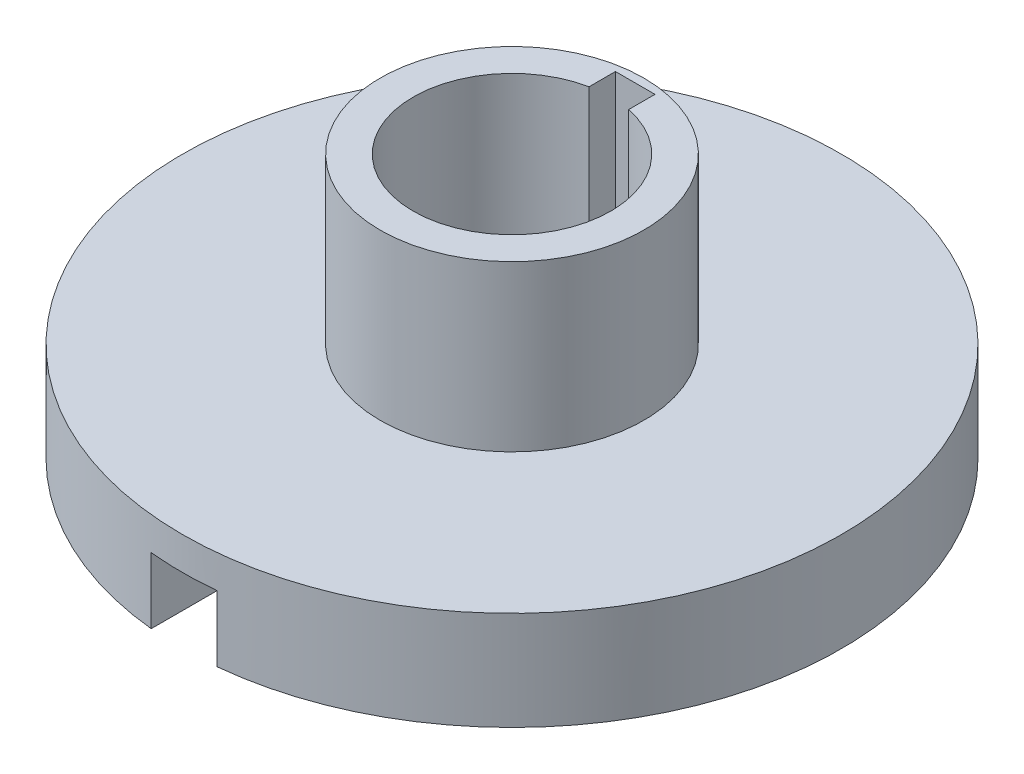
ISO-10303-21;
HEADER;
FILE_DESCRIPTION(('STEP AP214'),'2;1');
FILE_NAME('part.step','',(''),(''),'','','');
FILE_SCHEMA(('AUTOMOTIVE_DESIGN { 1 0 10303 214 1 1 1 1 }'));
ENDSEC;
DATA;
#1=APPLICATION_CONTEXT('core data for automotive mechanical design processes');
#2=APPLICATION_PROTOCOL_DEFINITION('international standard','automotive_design',2000,#1);
#3=PRODUCT_CONTEXT('',#1,'mechanical');
#4=PRODUCT('Part','Part','',(#3));
#5=PRODUCT_RELATED_PRODUCT_CATEGORY('part','',(#4));
#6=PRODUCT_DEFINITION_FORMATION('','',#4);
#7=PRODUCT_DEFINITION_CONTEXT('part definition',#1,'design');
#8=PRODUCT_DEFINITION('design','',#6,#7);
#9=PRODUCT_DEFINITION_SHAPE('','',#8);
#10=(LENGTH_UNIT() NAMED_UNIT(*) SI_UNIT(.MILLI.,.METRE.));
#11=(NAMED_UNIT(*) PLANE_ANGLE_UNIT() SI_UNIT($,.RADIAN.));
#12=(NAMED_UNIT(*) SI_UNIT($,.STERADIAN.) SOLID_ANGLE_UNIT());
#13=UNCERTAINTY_MEASURE_WITH_UNIT(LENGTH_MEASURE(1.E-05),#10,'distance_accuracy_value','');
#14=(GEOMETRIC_REPRESENTATION_CONTEXT(3) GLOBAL_UNCERTAINTY_ASSIGNED_CONTEXT((#13)) GLOBAL_UNIT_ASSIGNED_CONTEXT((#10,
#11,#12)) REPRESENTATION_CONTEXT('',''));
#15=CARTESIAN_POINT('',(0.,0.,0.));
#16=DIRECTION('',(0.,0.,1.));
#17=DIRECTION('',(1.,0.,0.));
#18=AXIS2_PLACEMENT_3D('',#15,#16,#17);
#19=CARTESIAN_POINT('',(0.,0.,0.));
#20=DIRECTION('',(0.,1.,0.));
#21=DIRECTION('',(0.,0.,1.));
#22=AXIS2_PLACEMENT_3D('',#19,#20,#21);
#23=PLANE('',#22);
#24=CARTESIAN_POINT('',(0.,0.,0.));
#25=DIRECTION('',(0.,1.,0.));
#26=DIRECTION('',(0.,0.,1.));
#27=AXIS2_PLACEMENT_3D('',#24,#25,#26);
#28=CIRCLE('',#27,50.);
#29=CARTESIAN_POINT('',(5.00000000000001,0.,49.749371855331));
#30=VERTEX_POINT('',#29);
#31=CARTESIAN_POINT('',(5.,0.,-49.749371855331));
#32=VERTEX_POINT('',#31);
#33=EDGE_CURVE('E220',#30,#32,#28,.T.);
#34=ORIENTED_EDGE('',*,*,#33,.F.);
#35=DIRECTION('',(0.,0.,1.));
#36=VECTOR('',#35,1.);
#37=CARTESIAN_POINT('',(5.00000000000001,0.,49.749371855331));
#38=LINE('',#37,#36);
#39=CARTESIAN_POINT('',(5.00000000000001,0.,14.1421356237309));
#40=VERTEX_POINT('',#39);
#41=EDGE_CURVE('E252',#40,#30,#38,.T.);
#42=ORIENTED_EDGE('',*,*,#41,.F.);
#43=CARTESIAN_POINT('',(0.,0.,0.));
#44=DIRECTION('',(0.,1.,0.));
#45=DIRECTION('',(0.,0.,1.));
#46=AXIS2_PLACEMENT_3D('',#43,#44,#45);
#47=CIRCLE('',#46,15.);
#48=CARTESIAN_POINT('',(5.00000000000001,0.,-14.1421356237309));
#49=VERTEX_POINT('',#48);
#50=EDGE_CURVE('E196',#40,#49,#47,.T.);
#51=ORIENTED_EDGE('',*,*,#50,.T.);
#52=EDGE_CURVE('E148',#32,#49,#38,.T.);
#53=ORIENTED_EDGE('',*,*,#52,.F.);
#54=EDGE_LOOP('',(#34,#42,#51,#53));
#55=FACE_BOUND('',#54,.T.);
#56=ADVANCED_FACE('F41',(#55),#23,.F.);
#57=CARTESIAN_POINT('',(-3.,40.,0.));
#58=DIRECTION('',(-1.,0.,0.));
#59=DIRECTION('',(0.,0.,1.));
#60=AXIS2_PLACEMENT_3D('',#57,#58,#59);
#61=PLANE('',#60);
#62=DIRECTION('',(0.,0.,1.));
#63=VECTOR('',#62,1.);
#64=CARTESIAN_POINT('',(-3.,10.,0.));
#65=LINE('',#64,#63);
#66=CARTESIAN_POINT('',(-3.,10.,-18.6969384566991));
#67=VERTEX_POINT('',#66);
#68=CARTESIAN_POINT('',(-3.,10.,-14.6969384566991));
#69=VERTEX_POINT('',#68);
#70=EDGE_CURVE('E169',#67,#69,#65,.T.);
#71=ORIENTED_EDGE('',*,*,#70,.F.);
#72=DIRECTION('',(0.,-1.,0.));
#73=VECTOR('',#72,1.);
#74=CARTESIAN_POINT('',(-3.,40.,-18.6969384566991));
#75=LINE('',#74,#73);
#76=CARTESIAN_POINT('',(-3.,40.,-18.6969384566991));
#77=VERTEX_POINT('',#76);
#78=EDGE_CURVE('E207',#77,#67,#75,.T.);
#79=ORIENTED_EDGE('',*,*,#78,.F.);
#80=DIRECTION('',(0.,0.,-1.));
#81=VECTOR('',#80,1.);
#82=CARTESIAN_POINT('',(-3.,40.,0.));
#83=LINE('',#82,#81);
#84=CARTESIAN_POINT('',(-3.,40.,-14.6969384566991));
#85=VERTEX_POINT('',#84);
#86=EDGE_CURVE('E181',#85,#77,#83,.T.);
#87=ORIENTED_EDGE('',*,*,#86,.F.);
#88=DIRECTION('',(0.,-1.,0.));
#89=VECTOR('',#88,1.);
#90=CARTESIAN_POINT('',(-3.,40.,-14.6969384566991));
#91=LINE('',#90,#89);
#92=EDGE_CURVE('E211',#85,#69,#91,.T.);
#93=ORIENTED_EDGE('',*,*,#92,.T.);
#94=EDGE_LOOP('',(#71,#79,#87,#93));
#95=FACE_BOUND('',#94,.T.);
#96=ADVANCED_FACE('F286',(#95),#61,.F.);
#97=CARTESIAN_POINT('',(0.,40.,-18.6969384566991));
#98=DIRECTION('',(0.,0.,-1.));
#99=DIRECTION('',(-1.,0.,0.));
#100=AXIS2_PLACEMENT_3D('',#97,#98,#99);
#101=PLANE('',#100);
#102=DIRECTION('',(-1.,0.,0.));
#103=VECTOR('',#102,1.);
#104=CARTESIAN_POINT('',(0.,10.,-18.6969384566991));
#105=LINE('',#104,#103);
#106=CARTESIAN_POINT('',(3.,10.,-18.6969384566991));
#107=VERTEX_POINT('',#106);
#108=EDGE_CURVE('E166',#107,#67,#105,.T.);
#109=ORIENTED_EDGE('',*,*,#108,.F.);
#110=DIRECTION('',(0.,-1.,0.));
#111=VECTOR('',#110,1.);
#112=CARTESIAN_POINT('',(3.,40.,-18.6969384566991));
#113=LINE('',#112,#111);
#114=CARTESIAN_POINT('',(3.,40.,-18.6969384566991));
#115=VERTEX_POINT('',#114);
#116=EDGE_CURVE('E203',#115,#107,#113,.T.);
#117=ORIENTED_EDGE('',*,*,#116,.F.);
#118=DIRECTION('',(1.,0.,0.));
#119=VECTOR('',#118,1.);
#120=CARTESIAN_POINT('',(0.,40.,-18.6969384566991));
#121=LINE('',#120,#119);
#122=EDGE_CURVE('E185',#77,#115,#121,.T.);
#123=ORIENTED_EDGE('',*,*,#122,.F.);
#124=ORIENTED_EDGE('',*,*,#78,.T.);
#125=EDGE_LOOP('',(#109,#117,#123,#124));
#126=FACE_BOUND('',#125,.T.);
#127=ADVANCED_FACE('F281',(#126),#101,.F.);
#128=CARTESIAN_POINT('',(3.,40.,0.));
#129=DIRECTION('',(1.,0.,0.));
#130=DIRECTION('',(0.,0.,-1.));
#131=AXIS2_PLACEMENT_3D('',#128,#129,#130);
#132=PLANE('',#131);
#133=DIRECTION('',(0.,0.,-1.));
#134=VECTOR('',#133,1.);
#135=CARTESIAN_POINT('',(3.,10.,0.));
#136=LINE('',#135,#134);
#137=CARTESIAN_POINT('',(3.,10.,-14.6969384566991));
#138=VERTEX_POINT('',#137);
#139=EDGE_CURVE('E224',#138,#107,#136,.T.);
#140=ORIENTED_EDGE('',*,*,#139,.F.);
#141=DIRECTION('',(0.,-1.,0.));
#142=VECTOR('',#141,1.);
#143=CARTESIAN_POINT('',(3.,40.,-14.6969384566991));
#144=LINE('',#143,#142);
#145=CARTESIAN_POINT('',(3.,40.,-14.6969384566991));
#146=VERTEX_POINT('',#145);
#147=EDGE_CURVE('E195',#146,#138,#144,.T.);
#148=ORIENTED_EDGE('',*,*,#147,.F.);
#149=DIRECTION('',(0.,0.,1.));
#150=VECTOR('',#149,1.);
#151=CARTESIAN_POINT('',(3.,40.,0.));
#152=LINE('',#151,#150);
#153=EDGE_CURVE('E188',#115,#146,#152,.T.);
#154=ORIENTED_EDGE('',*,*,#153,.F.);
#155=ORIENTED_EDGE('',*,*,#116,.T.);
#156=EDGE_LOOP('',(#140,#148,#154,#155));
#157=FACE_BOUND('',#156,.T.);
#158=ADVANCED_FACE('F276',(#157),#132,.F.);
#159=CARTESIAN_POINT('',(0.,15.,0.));
#160=DIRECTION('',(0.,-1.,0.));
#161=DIRECTION('',(0.,0.,-1.));
#162=AXIS2_PLACEMENT_3D('',#159,#160,#161);
#163=CYLINDRICAL_SURFACE('',#162,50.);
#164=CARTESIAN_POINT('',(0.,10.,0.));
#165=DIRECTION('',(0.,-1.,0.));
#166=DIRECTION('',(0.,0.,-1.));
#167=AXIS2_PLACEMENT_3D('',#164,#165,#166);
#168=CIRCLE('',#167,50.);
#169=CARTESIAN_POINT('',(5.00000000000001,10.,49.749371855331));
#170=VERTEX_POINT('',#169);
#171=CARTESIAN_POINT('',(-4.99999999999999,10.,49.749371855331));
#172=VERTEX_POINT('',#171);
#173=EDGE_CURVE('E140',#170,#172,#168,.T.);
#174=ORIENTED_EDGE('',*,*,#173,.F.);
#175=DIRECTION('',(0.,-1.,0.));
#176=VECTOR('',#175,1.);
#177=CARTESIAN_POINT('',(5.00000000000001,10.,49.749371855331));
#178=LINE('',#177,#176);
#179=EDGE_CURVE('E170',#170,#30,#178,.T.);
#180=ORIENTED_EDGE('',*,*,#179,.T.);
#181=ORIENTED_EDGE('',*,*,#33,.T.);
#182=DIRECTION('',(0.,-1.,0.));
#183=VECTOR('',#182,1.);
#184=CARTESIAN_POINT('',(5.,10.,-49.749371855331));
#185=LINE('',#184,#183);
#186=CARTESIAN_POINT('',(5.,10.,-49.749371855331));
#187=VERTEX_POINT('',#186);
#188=EDGE_CURVE('E161',#187,#32,#185,.T.);
#189=ORIENTED_EDGE('',*,*,#188,.F.);
#190=CARTESIAN_POINT('',(0.,10.,0.));
#191=DIRECTION('',(0.,-1.,0.));
#192=DIRECTION('',(0.,0.,-1.));
#193=AXIS2_PLACEMENT_3D('',#190,#191,#192);
#194=CIRCLE('',#193,50.);
#195=CARTESIAN_POINT('',(-4.99999999999999,10.,-49.749371855331));
#196=VERTEX_POINT('',#195);
#197=EDGE_CURVE('E136',#196,#187,#194,.T.);
#198=ORIENTED_EDGE('',*,*,#197,.F.);
#199=DIRECTION('',(0.,-1.,0.));
#200=VECTOR('',#199,1.);
#201=CARTESIAN_POINT('',(-4.99999999999999,10.,-49.749371855331));
#202=LINE('',#201,#200);
#203=CARTESIAN_POINT('',(-4.99999999999999,0.,-49.749371855331));
#204=VERTEX_POINT('',#203);
#205=EDGE_CURVE('E156',#196,#204,#202,.T.);
#206=ORIENTED_EDGE('',*,*,#205,.T.);
#207=CARTESIAN_POINT('',(-4.99999999999999,0.,49.749371855331));
#208=VERTEX_POINT('',#207);
#209=EDGE_CURVE('E154',#204,#208,#28,.T.);
#210=ORIENTED_EDGE('',*,*,#209,.T.);
#211=DIRECTION('',(0.,-1.,0.));
#212=VECTOR('',#211,1.);
#213=CARTESIAN_POINT('',(-4.99999999999999,10.,49.749371855331));
#214=LINE('',#213,#212);
#215=EDGE_CURVE('E131',#172,#208,#214,.T.);
#216=ORIENTED_EDGE('',*,*,#215,.F.);
#217=EDGE_LOOP('',(#174,#180,#181,#189,#198,#206,#210,#216));
#218=FACE_BOUND('',#217,.T.);
#219=CARTESIAN_POINT('',(0.,15.,0.));
#220=DIRECTION('',(0.,1.,0.));
#221=DIRECTION('',(0.,0.,1.));
#222=AXIS2_PLACEMENT_3D('',#219,#220,#221);
#223=CIRCLE('',#222,50.);
#224=CARTESIAN_POINT('',(0.,15.,50.));
#225=VERTEX_POINT('',#224);
#226=EDGE_CURVE('E219',#225,#225,#223,.T.);
#227=ORIENTED_EDGE('',*,*,#226,.F.);
#228=EDGE_LOOP('',(#227));
#229=FACE_BOUND('',#228,.T.);
#230=ADVANCED_FACE('F43',(#218,#229),#163,.T.);
#231=CARTESIAN_POINT('',(0.,15.,0.));
#232=DIRECTION('',(0.,1.,0.));
#233=DIRECTION('',(0.,0.,1.));
#234=AXIS2_PLACEMENT_3D('',#231,#232,#233);
#235=PLANE('',#234);
#236=CARTESIAN_POINT('',(0.,15.,0.));
#237=DIRECTION('',(0.,1.,0.));
#238=DIRECTION('',(0.,0.,1.));
#239=AXIS2_PLACEMENT_3D('',#236,#237,#238);
#240=CIRCLE('',#239,20.);
#241=CARTESIAN_POINT('',(0.,15.,20.));
#242=VERTEX_POINT('',#241);
#243=EDGE_CURVE('E215',#242,#242,#240,.T.);
#244=ORIENTED_EDGE('',*,*,#243,.F.);
#245=EDGE_LOOP('',(#244));
#246=FACE_BOUND('',#245,.T.);
#247=ORIENTED_EDGE('',*,*,#226,.T.);
#248=EDGE_LOOP('',(#247));
#249=FACE_BOUND('',#248,.T.);
#250=ADVANCED_FACE('F314',(#246,#249),#235,.T.);
#251=ORIENTED_EDGE('',*,*,#209,.F.);
#252=DIRECTION('',(0.,0.,-1.));
#253=VECTOR('',#252,1.);
#254=CARTESIAN_POINT('',(-4.99999999999999,0.,49.749371855331));
#255=LINE('',#254,#253);
#256=CARTESIAN_POINT('',(-4.99999999999999,0.,-14.142135623731));
#257=VERTEX_POINT('',#256);
#258=EDGE_CURVE('E255',#257,#204,#255,.T.);
#259=ORIENTED_EDGE('',*,*,#258,.F.);
#260=CARTESIAN_POINT('',(-4.99999999999999,0.,14.142135623731));
#261=VERTEX_POINT('',#260);
#262=EDGE_CURVE('E182',#257,#261,#47,.T.);
#263=ORIENTED_EDGE('',*,*,#262,.T.);
#264=EDGE_CURVE('E253',#208,#261,#255,.T.);
#265=ORIENTED_EDGE('',*,*,#264,.F.);
#266=EDGE_LOOP('',(#251,#259,#263,#265));
#267=FACE_BOUND('',#266,.T.);
#268=ADVANCED_FACE('F293',(#267),#23,.F.);
#269=CARTESIAN_POINT('',(0.,40.,0.));
#270=DIRECTION('',(0.,-1.,0.));
#271=DIRECTION('',(0.,0.,-1.));
#272=AXIS2_PLACEMENT_3D('',#269,#270,#271);
#273=CYLINDRICAL_SURFACE('',#272,15.);
#274=DIRECTION('',(0.,-1.,0.));
#275=VECTOR('',#274,1.);
#276=CARTESIAN_POINT('',(5.00000000000001,40.,14.1421356237309));
#277=LINE('',#276,#275);
#278=CARTESIAN_POINT('',(5.00000000000001,10.,14.1421356237309));
#279=VERTEX_POINT('',#278);
#280=EDGE_CURVE('E11',#279,#40,#277,.T.);
#281=ORIENTED_EDGE('',*,*,#280,.F.);
#282=CARTESIAN_POINT('',(0.,10.,0.));
#283=DIRECTION('',(0.,-1.,0.));
#284=DIRECTION('',(0.,0.,-1.));
#285=AXIS2_PLACEMENT_3D('',#282,#283,#284);
#286=CIRCLE('',#285,15.);
#287=CARTESIAN_POINT('',(-4.99999999999999,10.,14.142135623731));
#288=VERTEX_POINT('',#287);
#289=EDGE_CURVE('E176',#279,#288,#286,.T.);
#290=ORIENTED_EDGE('',*,*,#289,.T.);
#291=DIRECTION('',(0.,-1.,0.));
#292=VECTOR('',#291,1.);
#293=CARTESIAN_POINT('',(-4.99999999999999,40.,14.142135623731));
#294=LINE('',#293,#292);
#295=EDGE_CURVE('E50',#261,#288,#294,.F.);
#296=ORIENTED_EDGE('',*,*,#295,.F.);
#297=ORIENTED_EDGE('',*,*,#262,.F.);
#298=DIRECTION('',(0.,-1.,0.));
#299=VECTOR('',#298,1.);
#300=CARTESIAN_POINT('',(-4.99999999999999,40.,-14.142135623731));
#301=LINE('',#300,#299);
#302=CARTESIAN_POINT('',(-4.99999999999999,10.,-14.142135623731));
#303=VERTEX_POINT('',#302);
#304=EDGE_CURVE('E233',#303,#257,#301,.T.);
#305=ORIENTED_EDGE('',*,*,#304,.F.);
#306=EDGE_CURVE('E175',#303,#69,#286,.T.);
#307=ORIENTED_EDGE('',*,*,#306,.T.);
#308=ORIENTED_EDGE('',*,*,#92,.F.);
#309=CARTESIAN_POINT('',(0.,40.,0.));
#310=DIRECTION('',(0.,1.,0.));
#311=DIRECTION('',(0.,0.,1.));
#312=AXIS2_PLACEMENT_3D('',#309,#310,#311);
#313=CIRCLE('',#312,15.);
#314=EDGE_CURVE('E177',#85,#146,#313,.T.);
#315=ORIENTED_EDGE('',*,*,#314,.T.);
#316=ORIENTED_EDGE('',*,*,#147,.T.);
#317=CARTESIAN_POINT('',(5.00000000000001,10.,-14.1421356237309));
#318=VERTEX_POINT('',#317);
#319=EDGE_CURVE('E65',#138,#318,#286,.T.);
#320=ORIENTED_EDGE('',*,*,#319,.T.);
#321=DIRECTION('',(0.,-1.,0.));
#322=VECTOR('',#321,1.);
#323=CARTESIAN_POINT('',(5.00000000000001,40.,-14.1421356237309));
#324=LINE('',#323,#322);
#325=EDGE_CURVE('E230',#49,#318,#324,.F.);
#326=ORIENTED_EDGE('',*,*,#325,.F.);
#327=ORIENTED_EDGE('',*,*,#50,.F.);
#328=EDGE_LOOP('',(#281,#290,#296,#297,#305,#307,#308,#315,#316,#320,#326,#327));
#329=FACE_BOUND('',#328,.T.);
#330=ADVANCED_FACE('F271',(#329),#273,.F.);
#331=CARTESIAN_POINT('',(0.,40.,0.));
#332=DIRECTION('',(0.,-1.,0.));
#333=DIRECTION('',(0.,0.,-1.));
#334=AXIS2_PLACEMENT_3D('',#331,#332,#333);
#335=CYLINDRICAL_SURFACE('',#334,20.);
#336=ORIENTED_EDGE('',*,*,#243,.T.);
#337=EDGE_LOOP('',(#336));
#338=FACE_BOUND('',#337,.T.);
#339=CARTESIAN_POINT('',(0.,40.,0.));
#340=DIRECTION('',(0.,1.,0.));
#341=DIRECTION('',(0.,0.,1.));
#342=AXIS2_PLACEMENT_3D('',#339,#340,#341);
#343=CIRCLE('',#342,20.);
#344=CARTESIAN_POINT('',(0.,40.,20.));
#345=VERTEX_POINT('',#344);
#346=EDGE_CURVE('E191',#345,#345,#343,.T.);
#347=ORIENTED_EDGE('',*,*,#346,.F.);
#348=EDGE_LOOP('',(#347));
#349=FACE_BOUND('',#348,.T.);
#350=ADVANCED_FACE('F319',(#338,#349),#335,.T.);
#351=CARTESIAN_POINT('',(0.,40.,0.));
#352=DIRECTION('',(0.,1.,0.));
#353=DIRECTION('',(0.,0.,1.));
#354=AXIS2_PLACEMENT_3D('',#351,#352,#353);
#355=PLANE('',#354);
#356=ORIENTED_EDGE('',*,*,#314,.F.);
#357=ORIENTED_EDGE('',*,*,#86,.T.);
#358=ORIENTED_EDGE('',*,*,#122,.T.);
#359=ORIENTED_EDGE('',*,*,#153,.T.);
#360=EDGE_LOOP('',(#356,#357,#358,#359));
#361=FACE_BOUND('',#360,.T.);
#362=ORIENTED_EDGE('',*,*,#346,.T.);
#363=EDGE_LOOP('',(#362));
#364=FACE_BOUND('',#363,.T.);
#365=ADVANCED_FACE('F334',(#361,#364),#355,.T.);
#366=CARTESIAN_POINT('',(0.,10.,0.));
#367=DIRECTION('',(0.,-1.,0.));
#368=DIRECTION('',(0.,0.,-1.));
#369=AXIS2_PLACEMENT_3D('',#366,#367,#368);
#370=PLANE('',#369);
#371=DIRECTION('',(0.,0.,-1.));
#372=VECTOR('',#371,1.);
#373=CARTESIAN_POINT('',(-4.99999999999999,10.,49.749371855331));
#374=LINE('',#373,#372);
#375=EDGE_CURVE('E137',#303,#196,#374,.T.);
#376=ORIENTED_EDGE('',*,*,#375,.T.);
#377=ORIENTED_EDGE('',*,*,#197,.T.);
#378=DIRECTION('',(0.,0.,1.));
#379=VECTOR('',#378,1.);
#380=CARTESIAN_POINT('',(5.00000000000001,10.,49.749371855331));
#381=LINE('',#380,#379);
#382=EDGE_CURVE('E157',#187,#318,#381,.T.);
#383=ORIENTED_EDGE('',*,*,#382,.T.);
#384=ORIENTED_EDGE('',*,*,#319,.F.);
#385=ORIENTED_EDGE('',*,*,#139,.T.);
#386=ORIENTED_EDGE('',*,*,#108,.T.);
#387=ORIENTED_EDGE('',*,*,#70,.T.);
#388=ORIENTED_EDGE('',*,*,#306,.F.);
#389=EDGE_LOOP('',(#376,#377,#383,#384,#385,#386,#387,#388));
#390=FACE_BOUND('',#389,.T.);
#391=ADVANCED_FACE('F260',(#390),#370,.T.);
#392=CARTESIAN_POINT('',(-4.99999999999999,10.,49.749371855331));
#393=DIRECTION('',(-1.,0.,0.));
#394=DIRECTION('',(0.,0.,1.));
#395=AXIS2_PLACEMENT_3D('',#392,#393,#394);
#396=PLANE('',#395);
#397=ORIENTED_EDGE('',*,*,#304,.T.);
#398=ORIENTED_EDGE('',*,*,#258,.T.);
#399=ORIENTED_EDGE('',*,*,#205,.F.);
#400=ORIENTED_EDGE('',*,*,#375,.F.);
#401=EDGE_LOOP('',(#397,#398,#399,#400));
#402=FACE_BOUND('',#401,.T.);
#403=ADVANCED_FACE('F291',(#402),#396,.F.);
#404=CARTESIAN_POINT('',(5.00000000000001,10.,49.749371855331));
#405=DIRECTION('',(1.,0.,0.));
#406=DIRECTION('',(0.,0.,-1.));
#407=AXIS2_PLACEMENT_3D('',#404,#405,#406);
#408=PLANE('',#407);
#409=ORIENTED_EDGE('',*,*,#325,.T.);
#410=ORIENTED_EDGE('',*,*,#382,.F.);
#411=ORIENTED_EDGE('',*,*,#188,.T.);
#412=ORIENTED_EDGE('',*,*,#52,.T.);
#413=EDGE_LOOP('',(#409,#410,#411,#412));
#414=FACE_BOUND('',#413,.T.);
#415=ADVANCED_FACE('F263',(#414),#408,.F.);
#416=ORIENTED_EDGE('',*,*,#280,.T.);
#417=ORIENTED_EDGE('',*,*,#41,.T.);
#418=ORIENTED_EDGE('',*,*,#179,.F.);
#419=EDGE_CURVE('E143',#279,#170,#381,.T.);
#420=ORIENTED_EDGE('',*,*,#419,.F.);
#421=EDGE_LOOP('',(#416,#417,#418,#420));
#422=FACE_BOUND('',#421,.T.);
#423=ADVANCED_FACE('F298',(#422),#408,.F.);
#424=ORIENTED_EDGE('',*,*,#419,.T.);
#425=ORIENTED_EDGE('',*,*,#173,.T.);
#426=EDGE_CURVE('E57',#172,#288,#374,.T.);
#427=ORIENTED_EDGE('',*,*,#426,.T.);
#428=ORIENTED_EDGE('',*,*,#289,.F.);
#429=EDGE_LOOP('',(#424,#425,#427,#428));
#430=FACE_BOUND('',#429,.T.);
#431=ADVANCED_FACE('F141',(#430),#370,.T.);
#432=ORIENTED_EDGE('',*,*,#295,.T.);
#433=ORIENTED_EDGE('',*,*,#426,.F.);
#434=ORIENTED_EDGE('',*,*,#215,.T.);
#435=ORIENTED_EDGE('',*,*,#264,.T.);
#436=EDGE_LOOP('',(#432,#433,#434,#435));
#437=FACE_BOUND('',#436,.T.);
#438=ADVANCED_FACE('F129',(#437),#396,.F.);
#439=CLOSED_SHELL('',(#56,#96,#127,#158,#230,#250,#268,#330,#350,#365,#391,#403,#415,#423,#431,#438));
#440=MANIFOLD_SOLID_BREP('B2',#439);
#441=ADVANCED_BREP_SHAPE_REPRESENTATION('',(#18,#440),#14);
#442=SHAPE_DEFINITION_REPRESENTATION(#9,#441);
ENDSEC;
END-ISO-10303-21;
